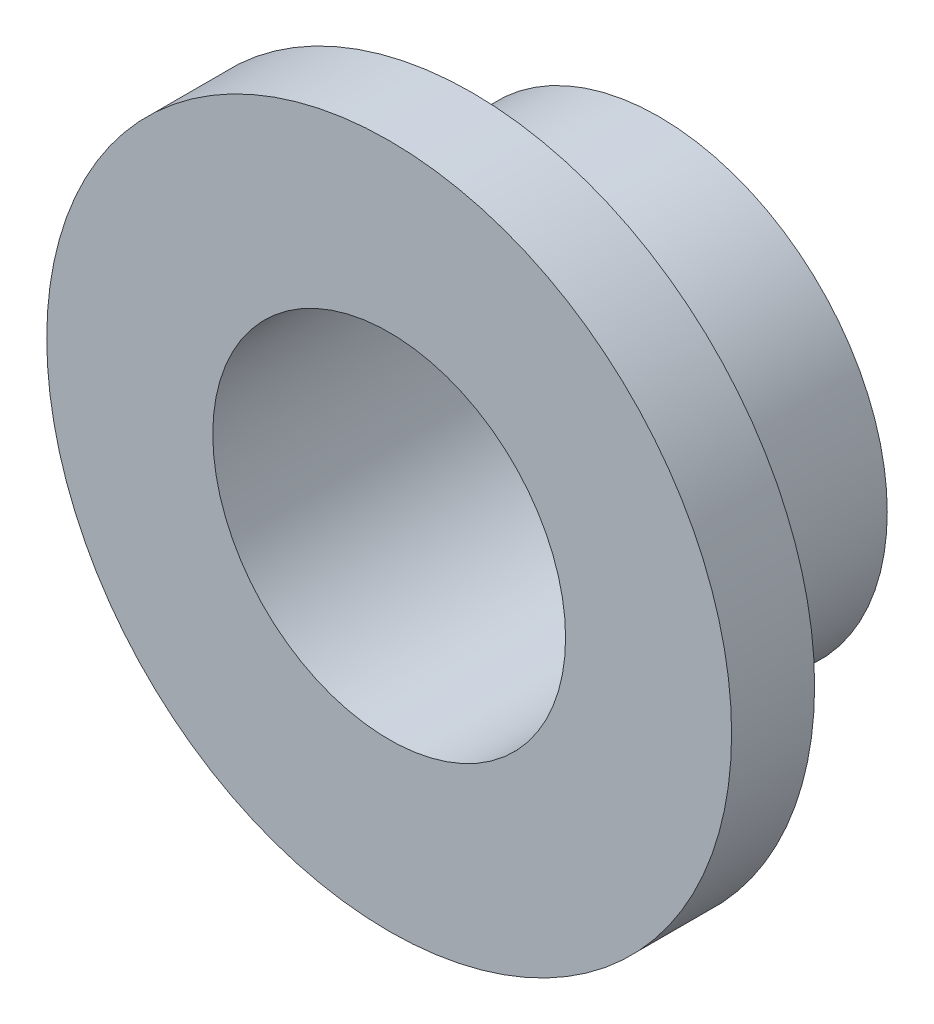
ISO-10303-21;
HEADER;
FILE_DESCRIPTION(('STEP AP214'),'2;1');
FILE_NAME('part.step','',(''),(''),'','','');
FILE_SCHEMA(('AUTOMOTIVE_DESIGN { 1 0 10303 214 1 1 1 1 }'));
ENDSEC;
DATA;
#1=APPLICATION_CONTEXT('core data for automotive mechanical design processes');
#2=APPLICATION_PROTOCOL_DEFINITION('international standard','automotive_design',2000,#1);
#3=PRODUCT_CONTEXT('',#1,'mechanical');
#4=PRODUCT('Part','Part','',(#3));
#5=PRODUCT_RELATED_PRODUCT_CATEGORY('part','',(#4));
#6=PRODUCT_DEFINITION_FORMATION('','',#4);
#7=PRODUCT_DEFINITION_CONTEXT('part definition',#1,'design');
#8=PRODUCT_DEFINITION('design','',#6,#7);
#9=PRODUCT_DEFINITION_SHAPE('','',#8);
#10=(LENGTH_UNIT() NAMED_UNIT(*) SI_UNIT(.MILLI.,.METRE.));
#11=(NAMED_UNIT(*) PLANE_ANGLE_UNIT() SI_UNIT($,.RADIAN.));
#12=(NAMED_UNIT(*) SI_UNIT($,.STERADIAN.) SOLID_ANGLE_UNIT());
#13=UNCERTAINTY_MEASURE_WITH_UNIT(LENGTH_MEASURE(1.E-05),#10,'distance_accuracy_value','');
#14=(GEOMETRIC_REPRESENTATION_CONTEXT(3) GLOBAL_UNCERTAINTY_ASSIGNED_CONTEXT((#13)) GLOBAL_UNIT_ASSIGNED_CONTEXT((#10,
#11,#12)) REPRESENTATION_CONTEXT('',''));
#15=CARTESIAN_POINT('',(0.,0.,0.));
#16=DIRECTION('',(0.,0.,1.));
#17=DIRECTION('',(1.,0.,0.));
#18=AXIS2_PLACEMENT_3D('',#15,#16,#17);
#19=CARTESIAN_POINT('',(0.,0.,-2.));
#20=DIRECTION('',(0.,0.,1.));
#21=DIRECTION('',(1.,0.,0.));
#22=AXIS2_PLACEMENT_3D('',#19,#20,#21);
#23=PLANE('',#22);
#24=CARTESIAN_POINT('',(0.,0.,-2.));
#25=DIRECTION('',(0.,0.,1.));
#26=DIRECTION('',(1.,0.,0.));
#27=AXIS2_PLACEMENT_3D('',#24,#25,#26);
#28=CIRCLE('',#27,8.25);
#29=CARTESIAN_POINT('',(8.25,0.,-2.));
#30=VERTEX_POINT('',#29);
#31=EDGE_CURVE('E39',#30,#30,#28,.T.);
#32=ORIENTED_EDGE('',*,*,#31,.F.);
#33=EDGE_LOOP('',(#32));
#34=FACE_BOUND('',#33,.T.);
#35=CARTESIAN_POINT('',(0.,0.,-2.));
#36=DIRECTION('',(0.,0.,1.));
#37=DIRECTION('',(1.,0.,0.));
#38=AXIS2_PLACEMENT_3D('',#35,#36,#37);
#39=CIRCLE('',#38,5.5);
#40=CARTESIAN_POINT('',(5.5,0.,-2.));
#41=VERTEX_POINT('',#40);
#42=EDGE_CURVE('E10',#41,#41,#39,.F.);
#43=ORIENTED_EDGE('',*,*,#42,.F.);
#44=EDGE_LOOP('',(#43));
#45=FACE_BOUND('',#44,.T.);
#46=ADVANCED_FACE('F32',(#34,#45),#23,.F.);
#47=CARTESIAN_POINT('',(0.,0.,-2.));
#48=DIRECTION('',(0.,0.,1.));
#49=DIRECTION('',(1.,0.,0.));
#50=AXIS2_PLACEMENT_3D('',#47,#48,#49);
#51=CYLINDRICAL_SURFACE('',#50,8.25);
#52=ORIENTED_EDGE('',*,*,#31,.T.);
#53=EDGE_LOOP('',(#52));
#54=FACE_BOUND('',#53,.T.);
#55=CARTESIAN_POINT('',(0.,0.,0.));
#56=DIRECTION('',(0.,0.,1.));
#57=DIRECTION('',(1.,0.,0.));
#58=AXIS2_PLACEMENT_3D('',#55,#56,#57);
#59=CIRCLE('',#58,8.25);
#60=CARTESIAN_POINT('',(8.25,0.,0.));
#61=VERTEX_POINT('',#60);
#62=EDGE_CURVE('E43',#61,#61,#59,.T.);
#63=ORIENTED_EDGE('',*,*,#62,.F.);
#64=EDGE_LOOP('',(#63));
#65=FACE_BOUND('',#64,.T.);
#66=ADVANCED_FACE('F34',(#54,#65),#51,.T.);
#67=CARTESIAN_POINT('',(0.,0.,0.));
#68=DIRECTION('',(0.,0.,1.));
#69=DIRECTION('',(1.,0.,0.));
#70=AXIS2_PLACEMENT_3D('',#67,#68,#69);
#71=PLANE('',#70);
#72=CARTESIAN_POINT('',(0.,0.,0.));
#73=DIRECTION('',(0.,0.,1.));
#74=DIRECTION('',(1.,0.,0.));
#75=AXIS2_PLACEMENT_3D('',#72,#73,#74);
#76=CIRCLE('',#75,4.25);
#77=CARTESIAN_POINT('',(4.25,0.,0.));
#78=VERTEX_POINT('',#77);
#79=EDGE_CURVE('E48',#78,#78,#76,.T.);
#80=ORIENTED_EDGE('',*,*,#79,.F.);
#81=EDGE_LOOP('',(#80));
#82=FACE_BOUND('',#81,.T.);
#83=ORIENTED_EDGE('',*,*,#62,.T.);
#84=EDGE_LOOP('',(#83));
#85=FACE_BOUND('',#84,.T.);
#86=ADVANCED_FACE('F72',(#82,#85),#71,.T.);
#87=CARTESIAN_POINT('',(0.,0.,-2.));
#88=DIRECTION('',(0.,0.,1.));
#89=DIRECTION('',(1.,0.,0.));
#90=AXIS2_PLACEMENT_3D('',#87,#88,#89);
#91=CYLINDRICAL_SURFACE('',#90,4.25);
#92=ORIENTED_EDGE('',*,*,#79,.T.);
#93=EDGE_LOOP('',(#92));
#94=FACE_BOUND('',#93,.T.);
#95=CARTESIAN_POINT('',(0.,0.,-6.5));
#96=DIRECTION('',(0.,0.,-1.));
#97=DIRECTION('',(-1.,0.,0.));
#98=AXIS2_PLACEMENT_3D('',#95,#96,#97);
#99=CIRCLE('',#98,4.25);
#100=CARTESIAN_POINT('',(-4.25,0.,-6.5));
#101=VERTEX_POINT('',#100);
#102=EDGE_CURVE('E55',#101,#101,#99,.T.);
#103=ORIENTED_EDGE('',*,*,#102,.T.);
#104=EDGE_LOOP('',(#103));
#105=FACE_BOUND('',#104,.T.);
#106=ADVANCED_FACE('F59',(#94,#105),#91,.F.);
#107=CARTESIAN_POINT('',(0.,0.,-6.5));
#108=DIRECTION('',(0.,0.,-1.));
#109=DIRECTION('',(-1.,0.,0.));
#110=AXIS2_PLACEMENT_3D('',#107,#108,#109);
#111=PLANE('',#110);
#112=CARTESIAN_POINT('',(0.,0.,-6.5));
#113=DIRECTION('',(0.,0.,-1.));
#114=DIRECTION('',(-1.,0.,0.));
#115=AXIS2_PLACEMENT_3D('',#112,#113,#114);
#116=CIRCLE('',#115,5.5);
#117=CARTESIAN_POINT('',(-5.5,0.,-6.5));
#118=VERTEX_POINT('',#117);
#119=EDGE_CURVE('E52',#118,#118,#116,.T.);
#120=ORIENTED_EDGE('',*,*,#119,.T.);
#121=EDGE_LOOP('',(#120));
#122=FACE_BOUND('',#121,.T.);
#123=ORIENTED_EDGE('',*,*,#102,.F.);
#124=EDGE_LOOP('',(#123));
#125=FACE_BOUND('',#124,.T.);
#126=ADVANCED_FACE('F61',(#122,#125),#111,.T.);
#127=CARTESIAN_POINT('',(0.,0.,-6.5));
#128=DIRECTION('',(0.,0.,1.));
#129=DIRECTION('',(1.,0.,0.));
#130=AXIS2_PLACEMENT_3D('',#127,#128,#129);
#131=CYLINDRICAL_SURFACE('',#130,5.5);
#132=ORIENTED_EDGE('',*,*,#119,.F.);
#133=EDGE_LOOP('',(#132));
#134=FACE_BOUND('',#133,.T.);
#135=ORIENTED_EDGE('',*,*,#42,.T.);
#136=EDGE_LOOP('',(#135));
#137=FACE_BOUND('',#136,.T.);
#138=ADVANCED_FACE('F63',(#134,#137),#131,.T.);
#139=CLOSED_SHELL('',(#46,#66,#86,#106,#126,#138));
#140=MANIFOLD_SOLID_BREP('B2',#139);
#141=ADVANCED_BREP_SHAPE_REPRESENTATION('',(#18,#140),#14);
#142=SHAPE_DEFINITION_REPRESENTATION(#9,#141);
ENDSEC;
END-ISO-10303-21;
